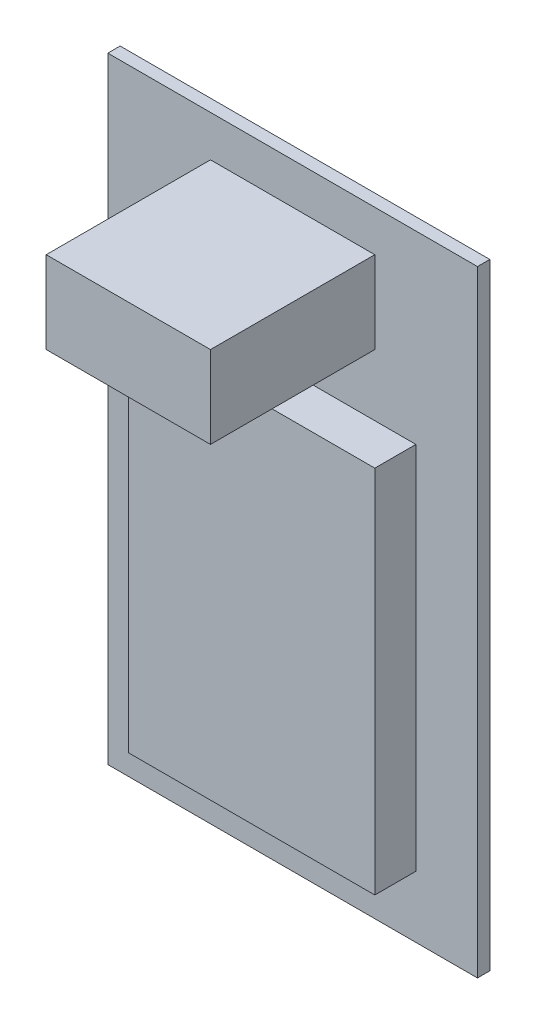
ISO-10303-21;
HEADER;
FILE_DESCRIPTION(('STEP AP214'),'2;1');
FILE_NAME('part.step','',(''),(''),'','','');
FILE_SCHEMA(('AUTOMOTIVE_DESIGN { 1 0 10303 214 1 1 1 1 }'));
ENDSEC;
DATA;
#1=APPLICATION_CONTEXT('core data for automotive mechanical design processes');
#2=APPLICATION_PROTOCOL_DEFINITION('international standard','automotive_design',2000,#1);
#3=PRODUCT_CONTEXT('',#1,'mechanical');
#4=PRODUCT('Part','Part','',(#3));
#5=PRODUCT_RELATED_PRODUCT_CATEGORY('part','',(#4));
#6=PRODUCT_DEFINITION_FORMATION('','',#4);
#7=PRODUCT_DEFINITION_CONTEXT('part definition',#1,'design');
#8=PRODUCT_DEFINITION('design','',#6,#7);
#9=PRODUCT_DEFINITION_SHAPE('','',#8);
#10=(LENGTH_UNIT() NAMED_UNIT(*) SI_UNIT(.MILLI.,.METRE.));
#11=(NAMED_UNIT(*) PLANE_ANGLE_UNIT() SI_UNIT($,.RADIAN.));
#12=(NAMED_UNIT(*) SI_UNIT($,.STERADIAN.) SOLID_ANGLE_UNIT());
#13=UNCERTAINTY_MEASURE_WITH_UNIT(LENGTH_MEASURE(1.E-05),#10,'distance_accuracy_value','');
#14=(GEOMETRIC_REPRESENTATION_CONTEXT(3) GLOBAL_UNCERTAINTY_ASSIGNED_CONTEXT((#13)) GLOBAL_UNIT_ASSIGNED_CONTEXT((#10,
#11,#12)) REPRESENTATION_CONTEXT('',''));
#15=CARTESIAN_POINT('',(0.,0.,0.));
#16=DIRECTION('',(0.,0.,1.));
#17=DIRECTION('',(1.,0.,0.));
#18=AXIS2_PLACEMENT_3D('',#15,#16,#17);
#19=CARTESIAN_POINT('',(0.,0.,3.));
#20=DIRECTION('',(0.,0.,-1.));
#21=DIRECTION('',(-1.,0.,0.));
#22=AXIS2_PLACEMENT_3D('',#19,#20,#21);
#23=PLANE('',#22);
#24=DIRECTION('',(0.,-1.,0.));
#25=VECTOR('',#24,1.);
#26=CARTESIAN_POINT('',(-75.,105.,3.));
#27=LINE('',#26,#25);
#28=CARTESIAN_POINT('',(-75.,105.,3.));
#29=VERTEX_POINT('',#28);
#30=CARTESIAN_POINT('',(-75.,15.,3.));
#31=VERTEX_POINT('',#30);
#32=EDGE_CURVE('E157',#29,#31,#27,.T.);
#33=ORIENTED_EDGE('',*,*,#32,.F.);
#34=DIRECTION('',(1.,0.,0.));
#35=VECTOR('',#34,1.);
#36=CARTESIAN_POINT('',(-75.,105.,3.));
#37=LINE('',#36,#35);
#38=CARTESIAN_POINT('',(-15.,105.,3.));
#39=VERTEX_POINT('',#38);
#40=EDGE_CURVE('E170',#29,#39,#37,.T.);
#41=ORIENTED_EDGE('',*,*,#40,.T.);
#42=DIRECTION('',(0.,-1.,0.));
#43=VECTOR('',#42,1.);
#44=CARTESIAN_POINT('',(-15.,105.,3.));
#45=LINE('',#44,#43);
#46=CARTESIAN_POINT('',(-15.,15.,3.));
#47=VERTEX_POINT('',#46);
#48=EDGE_CURVE('E181',#39,#47,#45,.T.);
#49=ORIENTED_EDGE('',*,*,#48,.T.);
#50=DIRECTION('',(1.,0.,0.));
#51=VECTOR('',#50,1.);
#52=CARTESIAN_POINT('',(-75.,15.,3.));
#53=LINE('',#52,#51);
#54=EDGE_CURVE('E160',#31,#47,#53,.T.);
#55=ORIENTED_EDGE('',*,*,#54,.F.);
#56=EDGE_LOOP('',(#33,#41,#49,#55));
#57=FACE_BOUND('',#56,.T.);
#58=DIRECTION('',(0.,1.,0.));
#59=VECTOR('',#58,1.);
#60=CARTESIAN_POINT('',(0.,150.,3.));
#61=LINE('',#60,#59);
#62=CARTESIAN_POINT('',(0.,0.,3.));
#63=VERTEX_POINT('',#62);
#64=CARTESIAN_POINT('',(0.,150.,3.));
#65=VERTEX_POINT('',#64);
#66=EDGE_CURVE('E196',#63,#65,#61,.T.);
#67=ORIENTED_EDGE('',*,*,#66,.T.);
#68=DIRECTION('',(-1.,0.,0.));
#69=VECTOR('',#68,1.);
#70=CARTESIAN_POINT('',(-90.,150.,3.));
#71=LINE('',#70,#69);
#72=CARTESIAN_POINT('',(-90.,150.,3.));
#73=VERTEX_POINT('',#72);
#74=EDGE_CURVE('E199',#65,#73,#71,.T.);
#75=ORIENTED_EDGE('',*,*,#74,.T.);
#76=DIRECTION('',(0.,-1.,0.));
#77=VECTOR('',#76,1.);
#78=CARTESIAN_POINT('',(-90.,0.,3.));
#79=LINE('',#78,#77);
#80=CARTESIAN_POINT('',(-90.,0.,3.));
#81=VERTEX_POINT('',#80);
#82=EDGE_CURVE('E202',#73,#81,#79,.T.);
#83=ORIENTED_EDGE('',*,*,#82,.T.);
#84=DIRECTION('',(1.,0.,0.));
#85=VECTOR('',#84,1.);
#86=CARTESIAN_POINT('',(0.,0.,3.));
#87=LINE('',#86,#85);
#88=EDGE_CURVE('E204',#81,#63,#87,.T.);
#89=ORIENTED_EDGE('',*,*,#88,.T.);
#90=EDGE_LOOP('',(#67,#75,#83,#89));
#91=FACE_BOUND('',#90,.T.);
#92=DIRECTION('',(0.,-1.,0.));
#93=VECTOR('',#92,1.);
#94=CARTESIAN_POINT('',(-65.,140.,3.));
#95=LINE('',#94,#93);
#96=CARTESIAN_POINT('',(-65.,140.,3.));
#97=VERTEX_POINT('',#96);
#98=CARTESIAN_POINT('',(-65.,120.,3.));
#99=VERTEX_POINT('',#98);
#100=EDGE_CURVE('E156',#97,#99,#95,.T.);
#101=ORIENTED_EDGE('',*,*,#100,.F.);
#102=DIRECTION('',(-1.,0.,0.));
#103=VECTOR('',#102,1.);
#104=CARTESIAN_POINT('',(-65.,140.,3.));
#105=LINE('',#104,#103);
#106=CARTESIAN_POINT('',(-25.,140.,3.));
#107=VERTEX_POINT('',#106);
#108=EDGE_CURVE('E153',#107,#97,#105,.T.);
#109=ORIENTED_EDGE('',*,*,#108,.F.);
#110=DIRECTION('',(0.,1.,0.));
#111=VECTOR('',#110,1.);
#112=CARTESIAN_POINT('',(-25.,140.,3.));
#113=LINE('',#112,#111);
#114=CARTESIAN_POINT('',(-25.,120.,3.));
#115=VERTEX_POINT('',#114);
#116=EDGE_CURVE('E67',#115,#107,#113,.T.);
#117=ORIENTED_EDGE('',*,*,#116,.F.);
#118=DIRECTION('',(1.,0.,0.));
#119=VECTOR('',#118,1.);
#120=CARTESIAN_POINT('',(-65.,120.,3.));
#121=LINE('',#120,#119);
#122=EDGE_CURVE('E62',#99,#115,#121,.T.);
#123=ORIENTED_EDGE('',*,*,#122,.F.);
#124=EDGE_LOOP('',(#101,#109,#117,#123));
#125=FACE_BOUND('',#124,.T.);
#126=ADVANCED_FACE('F47',(#57,#91,#125),#23,.F.);
#127=CARTESIAN_POINT('',(0.,150.,3.));
#128=DIRECTION('',(-1.,0.,0.));
#129=DIRECTION('',(0.,-1.,0.));
#130=AXIS2_PLACEMENT_3D('',#127,#128,#129);
#131=PLANE('',#130);
#132=DIRECTION('',(0.,1.,0.));
#133=VECTOR('',#132,1.);
#134=CARTESIAN_POINT('',(0.,150.,0.));
#135=LINE('',#134,#133);
#136=CARTESIAN_POINT('',(0.,0.,0.));
#137=VERTEX_POINT('',#136);
#138=CARTESIAN_POINT('',(0.,150.,0.));
#139=VERTEX_POINT('',#138);
#140=EDGE_CURVE('E195',#137,#139,#135,.T.);
#141=ORIENTED_EDGE('',*,*,#140,.T.);
#142=DIRECTION('',(0.,0.,-1.));
#143=VECTOR('',#142,1.);
#144=CARTESIAN_POINT('',(0.,150.,3.));
#145=LINE('',#144,#143);
#146=EDGE_CURVE('E11',#65,#139,#145,.T.);
#147=ORIENTED_EDGE('',*,*,#146,.F.);
#148=ORIENTED_EDGE('',*,*,#66,.F.);
#149=DIRECTION('',(0.,0.,-1.));
#150=VECTOR('',#149,1.);
#151=CARTESIAN_POINT('',(0.,0.,3.));
#152=LINE('',#151,#150);
#153=EDGE_CURVE('E206',#63,#137,#152,.T.);
#154=ORIENTED_EDGE('',*,*,#153,.T.);
#155=EDGE_LOOP('',(#141,#147,#148,#154));
#156=FACE_BOUND('',#155,.T.);
#157=ADVANCED_FACE('F49',(#156),#131,.F.);
#158=CARTESIAN_POINT('',(-90.,150.,3.));
#159=DIRECTION('',(0.,-1.,0.));
#160=DIRECTION('',(1.,0.,0.));
#161=AXIS2_PLACEMENT_3D('',#158,#159,#160);
#162=PLANE('',#161);
#163=DIRECTION('',(-1.,0.,0.));
#164=VECTOR('',#163,1.);
#165=CARTESIAN_POINT('',(-90.,150.,0.));
#166=LINE('',#165,#164);
#167=CARTESIAN_POINT('',(-90.,150.,0.));
#168=VERTEX_POINT('',#167);
#169=EDGE_CURVE('E209',#139,#168,#166,.T.);
#170=ORIENTED_EDGE('',*,*,#169,.T.);
#171=DIRECTION('',(0.,0.,-1.));
#172=VECTOR('',#171,1.);
#173=CARTESIAN_POINT('',(-90.,150.,3.));
#174=LINE('',#173,#172);
#175=EDGE_CURVE('E55',#73,#168,#174,.T.);
#176=ORIENTED_EDGE('',*,*,#175,.F.);
#177=ORIENTED_EDGE('',*,*,#74,.F.);
#178=ORIENTED_EDGE('',*,*,#146,.T.);
#179=EDGE_LOOP('',(#170,#176,#177,#178));
#180=FACE_BOUND('',#179,.T.);
#181=ADVANCED_FACE('F238',(#180),#162,.F.);
#182=CARTESIAN_POINT('',(-90.,0.,3.));
#183=DIRECTION('',(1.,0.,0.));
#184=DIRECTION('',(0.,0.,-1.));
#185=AXIS2_PLACEMENT_3D('',#182,#183,#184);
#186=PLANE('',#185);
#187=DIRECTION('',(0.,-1.,0.));
#188=VECTOR('',#187,1.);
#189=CARTESIAN_POINT('',(-90.,0.,0.));
#190=LINE('',#189,#188);
#191=CARTESIAN_POINT('',(-90.,0.,0.));
#192=VERTEX_POINT('',#191);
#193=EDGE_CURVE('E211',#168,#192,#190,.T.);
#194=ORIENTED_EDGE('',*,*,#193,.T.);
#195=DIRECTION('',(0.,0.,-1.));
#196=VECTOR('',#195,1.);
#197=CARTESIAN_POINT('',(-90.,0.,3.));
#198=LINE('',#197,#196);
#199=EDGE_CURVE('E216',#81,#192,#198,.T.);
#200=ORIENTED_EDGE('',*,*,#199,.F.);
#201=ORIENTED_EDGE('',*,*,#82,.F.);
#202=ORIENTED_EDGE('',*,*,#175,.T.);
#203=EDGE_LOOP('',(#194,#200,#201,#202));
#204=FACE_BOUND('',#203,.T.);
#205=ADVANCED_FACE('F223',(#204),#186,.F.);
#206=CARTESIAN_POINT('',(0.,0.,3.));
#207=DIRECTION('',(0.,1.,0.));
#208=DIRECTION('',(0.,0.,1.));
#209=AXIS2_PLACEMENT_3D('',#206,#207,#208);
#210=PLANE('',#209);
#211=DIRECTION('',(1.,0.,0.));
#212=VECTOR('',#211,1.);
#213=CARTESIAN_POINT('',(0.,0.,0.));
#214=LINE('',#213,#212);
#215=EDGE_CURVE('E200',#192,#137,#214,.T.);
#216=ORIENTED_EDGE('',*,*,#215,.T.);
#217=ORIENTED_EDGE('',*,*,#153,.F.);
#218=ORIENTED_EDGE('',*,*,#88,.F.);
#219=ORIENTED_EDGE('',*,*,#199,.T.);
#220=EDGE_LOOP('',(#216,#217,#218,#219));
#221=FACE_BOUND('',#220,.T.);
#222=ADVANCED_FACE('F232',(#221),#210,.F.);
#223=CARTESIAN_POINT('',(0.,0.,0.));
#224=DIRECTION('',(0.,0.,-1.));
#225=DIRECTION('',(-1.,0.,0.));
#226=AXIS2_PLACEMENT_3D('',#223,#224,#225);
#227=PLANE('',#226);
#228=ORIENTED_EDGE('',*,*,#140,.F.);
#229=ORIENTED_EDGE('',*,*,#215,.F.);
#230=ORIENTED_EDGE('',*,*,#193,.F.);
#231=ORIENTED_EDGE('',*,*,#169,.F.);
#232=EDGE_LOOP('',(#228,#229,#230,#231));
#233=FACE_BOUND('',#232,.T.);
#234=ADVANCED_FACE('F229',(#233),#227,.T.);
#235=CARTESIAN_POINT('',(-75.,105.,13.));
#236=DIRECTION('',(1.,0.,0.));
#237=DIRECTION('',(0.,1.,0.));
#238=AXIS2_PLACEMENT_3D('',#235,#236,#237);
#239=PLANE('',#238);
#240=ORIENTED_EDGE('',*,*,#32,.T.);
#241=DIRECTION('',(0.,0.,-1.));
#242=VECTOR('',#241,1.);
#243=CARTESIAN_POINT('',(-75.,15.,13.));
#244=LINE('',#243,#242);
#245=CARTESIAN_POINT('',(-75.,15.,13.));
#246=VERTEX_POINT('',#245);
#247=EDGE_CURVE('E192',#246,#31,#244,.T.);
#248=ORIENTED_EDGE('',*,*,#247,.F.);
#249=DIRECTION('',(0.,-1.,0.));
#250=VECTOR('',#249,1.);
#251=CARTESIAN_POINT('',(-75.,105.,13.));
#252=LINE('',#251,#250);
#253=CARTESIAN_POINT('',(-75.,105.,13.));
#254=VERTEX_POINT('',#253);
#255=EDGE_CURVE('E166',#254,#246,#252,.T.);
#256=ORIENTED_EDGE('',*,*,#255,.F.);
#257=DIRECTION('',(0.,0.,-1.));
#258=VECTOR('',#257,1.);
#259=CARTESIAN_POINT('',(-75.,105.,13.));
#260=LINE('',#259,#258);
#261=EDGE_CURVE('E177',#254,#29,#260,.T.);
#262=ORIENTED_EDGE('',*,*,#261,.T.);
#263=EDGE_LOOP('',(#240,#248,#256,#262));
#264=FACE_BOUND('',#263,.T.);
#265=ADVANCED_FACE('F253',(#264),#239,.F.);
#266=CARTESIAN_POINT('',(-75.,15.,13.));
#267=DIRECTION('',(0.,1.,0.));
#268=DIRECTION('',(0.,0.,1.));
#269=AXIS2_PLACEMENT_3D('',#266,#267,#268);
#270=PLANE('',#269);
#271=ORIENTED_EDGE('',*,*,#54,.T.);
#272=DIRECTION('',(0.,0.,-1.));
#273=VECTOR('',#272,1.);
#274=CARTESIAN_POINT('',(-15.,15.,13.));
#275=LINE('',#274,#273);
#276=CARTESIAN_POINT('',(-15.,15.,13.));
#277=VERTEX_POINT('',#276);
#278=EDGE_CURVE('E189',#277,#47,#275,.T.);
#279=ORIENTED_EDGE('',*,*,#278,.F.);
#280=DIRECTION('',(1.,0.,0.));
#281=VECTOR('',#280,1.);
#282=CARTESIAN_POINT('',(-75.,15.,13.));
#283=LINE('',#282,#281);
#284=EDGE_CURVE('E169',#246,#277,#283,.T.);
#285=ORIENTED_EDGE('',*,*,#284,.F.);
#286=ORIENTED_EDGE('',*,*,#247,.T.);
#287=EDGE_LOOP('',(#271,#279,#285,#286));
#288=FACE_BOUND('',#287,.T.);
#289=ADVANCED_FACE('F275',(#288),#270,.F.);
#290=CARTESIAN_POINT('',(-15.,105.,13.));
#291=DIRECTION('',(1.,0.,0.));
#292=DIRECTION('',(0.,1.,0.));
#293=AXIS2_PLACEMENT_3D('',#290,#291,#292);
#294=PLANE('',#293);
#295=ORIENTED_EDGE('',*,*,#48,.F.);
#296=DIRECTION('',(0.,0.,-1.));
#297=VECTOR('',#296,1.);
#298=CARTESIAN_POINT('',(-15.,105.,13.));
#299=LINE('',#298,#297);
#300=CARTESIAN_POINT('',(-15.,105.,13.));
#301=VERTEX_POINT('',#300);
#302=EDGE_CURVE('E186',#301,#39,#299,.T.);
#303=ORIENTED_EDGE('',*,*,#302,.F.);
#304=DIRECTION('',(0.,-1.,0.));
#305=VECTOR('',#304,1.);
#306=CARTESIAN_POINT('',(-15.,105.,13.));
#307=LINE('',#306,#305);
#308=EDGE_CURVE('E172',#301,#277,#307,.T.);
#309=ORIENTED_EDGE('',*,*,#308,.T.);
#310=ORIENTED_EDGE('',*,*,#278,.T.);
#311=EDGE_LOOP('',(#295,#303,#309,#310));
#312=FACE_BOUND('',#311,.T.);
#313=ADVANCED_FACE('F288',(#312),#294,.T.);
#314=CARTESIAN_POINT('',(-75.,105.,13.));
#315=DIRECTION('',(0.,1.,0.));
#316=DIRECTION('',(0.,0.,1.));
#317=AXIS2_PLACEMENT_3D('',#314,#315,#316);
#318=PLANE('',#317);
#319=ORIENTED_EDGE('',*,*,#40,.F.);
#320=ORIENTED_EDGE('',*,*,#261,.F.);
#321=DIRECTION('',(1.,0.,0.));
#322=VECTOR('',#321,1.);
#323=CARTESIAN_POINT('',(-75.,105.,13.));
#324=LINE('',#323,#322);
#325=EDGE_CURVE('E175',#254,#301,#324,.T.);
#326=ORIENTED_EDGE('',*,*,#325,.T.);
#327=ORIENTED_EDGE('',*,*,#302,.T.);
#328=EDGE_LOOP('',(#319,#320,#326,#327));
#329=FACE_BOUND('',#328,.T.);
#330=ADVANCED_FACE('F300',(#329),#318,.T.);
#331=CARTESIAN_POINT('',(0.,0.,13.));
#332=DIRECTION('',(0.,0.,1.));
#333=DIRECTION('',(1.,0.,0.));
#334=AXIS2_PLACEMENT_3D('',#331,#332,#333);
#335=PLANE('',#334);
#336=ORIENTED_EDGE('',*,*,#255,.T.);
#337=ORIENTED_EDGE('',*,*,#284,.T.);
#338=ORIENTED_EDGE('',*,*,#308,.F.);
#339=ORIENTED_EDGE('',*,*,#325,.F.);
#340=EDGE_LOOP('',(#336,#337,#338,#339));
#341=FACE_BOUND('',#340,.T.);
#342=ADVANCED_FACE('F313',(#341),#335,.T.);
#343=CARTESIAN_POINT('',(-65.,140.,43.));
#344=DIRECTION('',(1.,0.,0.));
#345=DIRECTION('',(0.,0.,-1.));
#346=AXIS2_PLACEMENT_3D('',#343,#344,#345);
#347=PLANE('',#346);
#348=ORIENTED_EDGE('',*,*,#100,.T.);
#349=DIRECTION('',(0.,0.,-1.));
#350=VECTOR('',#349,1.);
#351=CARTESIAN_POINT('',(-65.,120.,43.));
#352=LINE('',#351,#350);
#353=CARTESIAN_POINT('',(-65.,120.,43.));
#354=VERTEX_POINT('',#353);
#355=EDGE_CURVE('E137',#354,#99,#352,.T.);
#356=ORIENTED_EDGE('',*,*,#355,.F.);
#357=DIRECTION('',(0.,-1.,0.));
#358=VECTOR('',#357,1.);
#359=CARTESIAN_POINT('',(-65.,140.,43.));
#360=LINE('',#359,#358);
#361=CARTESIAN_POINT('',(-65.,140.,43.));
#362=VERTEX_POINT('',#361);
#363=EDGE_CURVE('E144',#362,#354,#360,.T.);
#364=ORIENTED_EDGE('',*,*,#363,.F.);
#365=DIRECTION('',(0.,0.,-1.));
#366=VECTOR('',#365,1.);
#367=CARTESIAN_POINT('',(-65.,140.,43.));
#368=LINE('',#367,#366);
#369=EDGE_CURVE('E448',#362,#97,#368,.T.);
#370=ORIENTED_EDGE('',*,*,#369,.T.);
#371=EDGE_LOOP('',(#348,#356,#364,#370));
#372=FACE_BOUND('',#371,.T.);
#373=ADVANCED_FACE('F155',(#372),#347,.F.);
#374=CARTESIAN_POINT('',(-65.,120.,43.));
#375=DIRECTION('',(0.,1.,0.));
#376=DIRECTION('',(0.,0.,1.));
#377=AXIS2_PLACEMENT_3D('',#374,#375,#376);
#378=PLANE('',#377);
#379=ORIENTED_EDGE('',*,*,#122,.T.);
#380=DIRECTION('',(0.,0.,-1.));
#381=VECTOR('',#380,1.);
#382=CARTESIAN_POINT('',(-25.,120.,43.));
#383=LINE('',#382,#381);
#384=CARTESIAN_POINT('',(-25.,120.,43.));
#385=VERTEX_POINT('',#384);
#386=EDGE_CURVE('E140',#385,#115,#383,.T.);
#387=ORIENTED_EDGE('',*,*,#386,.F.);
#388=DIRECTION('',(1.,0.,0.));
#389=VECTOR('',#388,1.);
#390=CARTESIAN_POINT('',(-65.,120.,43.));
#391=LINE('',#390,#389);
#392=EDGE_CURVE('E133',#354,#385,#391,.T.);
#393=ORIENTED_EDGE('',*,*,#392,.F.);
#394=ORIENTED_EDGE('',*,*,#355,.T.);
#395=EDGE_LOOP('',(#379,#387,#393,#394));
#396=FACE_BOUND('',#395,.T.);
#397=ADVANCED_FACE('F135',(#396),#378,.F.);
#398=CARTESIAN_POINT('',(-25.,140.,43.));
#399=DIRECTION('',(-1.,0.,0.));
#400=DIRECTION('',(0.,-1.,0.));
#401=AXIS2_PLACEMENT_3D('',#398,#399,#400);
#402=PLANE('',#401);
#403=ORIENTED_EDGE('',*,*,#116,.T.);
#404=DIRECTION('',(0.,0.,-1.));
#405=VECTOR('',#404,1.);
#406=CARTESIAN_POINT('',(-25.,140.,43.));
#407=LINE('',#406,#405);
#408=CARTESIAN_POINT('',(-25.,140.,43.));
#409=VERTEX_POINT('',#408);
#410=EDGE_CURVE('E162',#409,#107,#407,.T.);
#411=ORIENTED_EDGE('',*,*,#410,.F.);
#412=DIRECTION('',(0.,1.,0.));
#413=VECTOR('',#412,1.);
#414=CARTESIAN_POINT('',(-25.,140.,43.));
#415=LINE('',#414,#413);
#416=EDGE_CURVE('E143',#385,#409,#415,.T.);
#417=ORIENTED_EDGE('',*,*,#416,.F.);
#418=ORIENTED_EDGE('',*,*,#386,.T.);
#419=EDGE_LOOP('',(#403,#411,#417,#418));
#420=FACE_BOUND('',#419,.T.);
#421=ADVANCED_FACE('F358',(#420),#402,.F.);
#422=CARTESIAN_POINT('',(-65.,140.,43.));
#423=DIRECTION('',(0.,-1.,0.));
#424=DIRECTION('',(1.,0.,0.));
#425=AXIS2_PLACEMENT_3D('',#422,#423,#424);
#426=PLANE('',#425);
#427=ORIENTED_EDGE('',*,*,#108,.T.);
#428=ORIENTED_EDGE('',*,*,#369,.F.);
#429=DIRECTION('',(-1.,0.,0.));
#430=VECTOR('',#429,1.);
#431=CARTESIAN_POINT('',(-65.,140.,43.));
#432=LINE('',#431,#430);
#433=EDGE_CURVE('E149',#409,#362,#432,.T.);
#434=ORIENTED_EDGE('',*,*,#433,.F.);
#435=ORIENTED_EDGE('',*,*,#410,.T.);
#436=EDGE_LOOP('',(#427,#428,#434,#435));
#437=FACE_BOUND('',#436,.T.);
#438=ADVANCED_FACE('F370',(#437),#426,.F.);
#439=CARTESIAN_POINT('',(0.,0.,43.));
#440=DIRECTION('',(0.,0.,1.));
#441=DIRECTION('',(1.,0.,0.));
#442=AXIS2_PLACEMENT_3D('',#439,#440,#441);
#443=PLANE('',#442);
#444=ORIENTED_EDGE('',*,*,#363,.T.);
#445=ORIENTED_EDGE('',*,*,#392,.T.);
#446=ORIENTED_EDGE('',*,*,#416,.T.);
#447=ORIENTED_EDGE('',*,*,#433,.T.);
#448=EDGE_LOOP('',(#444,#445,#446,#447));
#449=FACE_BOUND('',#448,.T.);
#450=ADVANCED_FACE('F147',(#449),#443,.T.);
#451=CLOSED_SHELL('',(#126,#157,#181,#205,#222,#234,#265,#289,#313,#330,#342,#373,#397,#421,
#438,#450));
#452=MANIFOLD_SOLID_BREP('B2',#451);
#453=ADVANCED_BREP_SHAPE_REPRESENTATION('',(#18,#452),#14);
#454=SHAPE_DEFINITION_REPRESENTATION(#9,#453);
ENDSEC;
END-ISO-10303-21;
